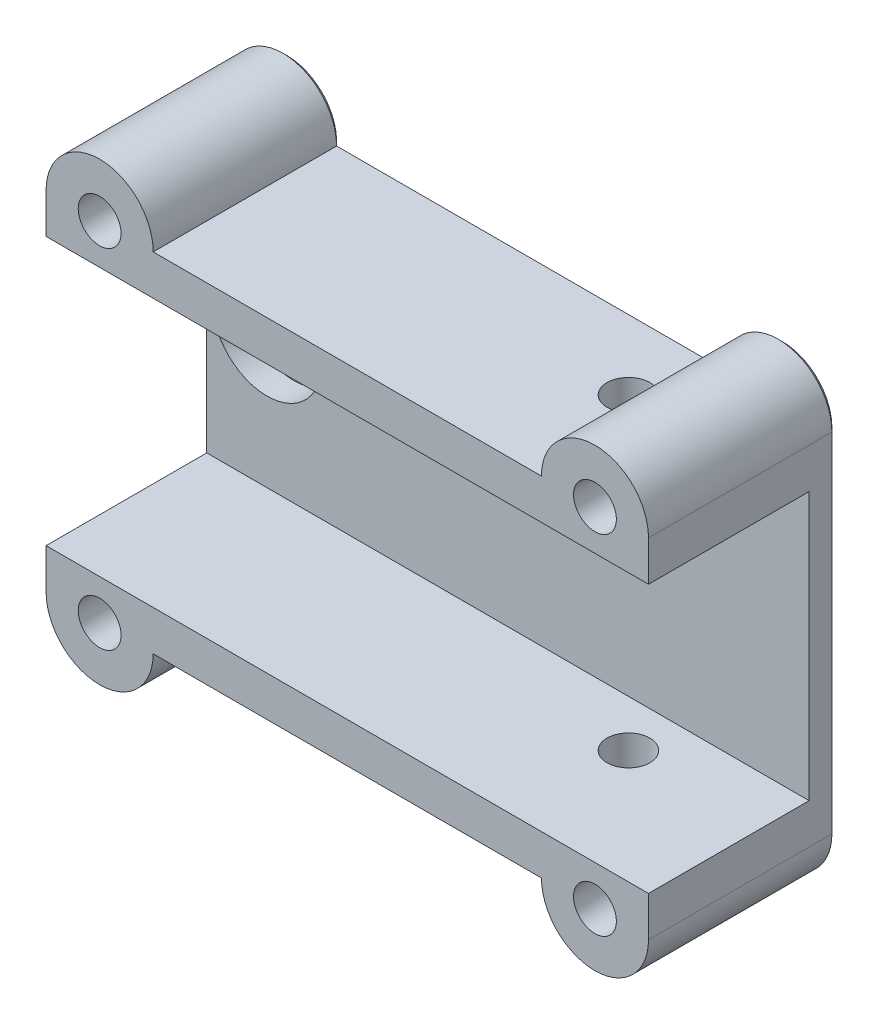
ISO-10303-21;
HEADER;
FILE_DESCRIPTION(('STEP AP214'),'2;1');
FILE_NAME('part.step','',(''),(''),'','','');
FILE_SCHEMA(('AUTOMOTIVE_DESIGN { 1 0 10303 214 1 1 1 1 }'));
ENDSEC;
DATA;
#1=APPLICATION_CONTEXT('core data for automotive mechanical design processes');
#2=APPLICATION_PROTOCOL_DEFINITION('international standard','automotive_design',2000,#1);
#3=PRODUCT_CONTEXT('',#1,'mechanical');
#4=PRODUCT('Part','Part','',(#3));
#5=PRODUCT_RELATED_PRODUCT_CATEGORY('part','',(#4));
#6=PRODUCT_DEFINITION_FORMATION('','',#4);
#7=PRODUCT_DEFINITION_CONTEXT('part definition',#1,'design');
#8=PRODUCT_DEFINITION('design','',#6,#7);
#9=PRODUCT_DEFINITION_SHAPE('','',#8);
#10=(LENGTH_UNIT() NAMED_UNIT(*) SI_UNIT(.MILLI.,.METRE.));
#11=(NAMED_UNIT(*) PLANE_ANGLE_UNIT() SI_UNIT($,.RADIAN.));
#12=(NAMED_UNIT(*) SI_UNIT($,.STERADIAN.) SOLID_ANGLE_UNIT());
#13=UNCERTAINTY_MEASURE_WITH_UNIT(LENGTH_MEASURE(1.E-05),#10,'distance_accuracy_value','');
#14=(GEOMETRIC_REPRESENTATION_CONTEXT(3) GLOBAL_UNCERTAINTY_ASSIGNED_CONTEXT((#13)) GLOBAL_UNIT_ASSIGNED_CONTEXT((#10,
#11,#12)) REPRESENTATION_CONTEXT('',''));
#15=CARTESIAN_POINT('',(0.,0.,0.));
#16=DIRECTION('',(0.,0.,1.));
#17=DIRECTION('',(1.,0.,0.));
#18=AXIS2_PLACEMENT_3D('',#15,#16,#17);
#19=CARTESIAN_POINT('',(56.1,536.,36.));
#20=DIRECTION('',(0.,0.,-1.));
#21=DIRECTION('',(-1.,0.,0.));
#22=AXIS2_PLACEMENT_3D('',#19,#20,#21);
#23=CYLINDRICAL_SURFACE('',#22,1.6);
#24=CARTESIAN_POINT('',(56.1,536.,14.));
#25=DIRECTION('',(0.,0.,-1.));
#26=DIRECTION('',(-1.,0.,0.));
#27=AXIS2_PLACEMENT_3D('',#24,#25,#26);
#28=CIRCLE('',#27,1.6);
#29=CARTESIAN_POINT('',(54.5,536.,14.));
#30=VERTEX_POINT('',#29);
#31=EDGE_CURVE('E230',#30,#30,#28,.T.);
#32=ORIENTED_EDGE('',*,*,#31,.F.);
#33=EDGE_LOOP('',(#32));
#34=FACE_BOUND('',#33,.T.);
#35=CARTESIAN_POINT('',(56.1,536.,3.3));
#36=DIRECTION('',(0.,0.,-1.));
#37=DIRECTION('',(-1.,0.,0.));
#38=AXIS2_PLACEMENT_3D('',#35,#36,#37);
#39=CIRCLE('',#38,1.6);
#40=CARTESIAN_POINT('',(54.5,536.,3.3));
#41=VERTEX_POINT('',#40);
#42=EDGE_CURVE('E53',#41,#41,#39,.F.);
#43=ORIENTED_EDGE('',*,*,#42,.F.);
#44=EDGE_LOOP('',(#43));
#45=FACE_BOUND('',#44,.T.);
#46=ADVANCED_FACE('F47',(#34,#45),#23,.F.);
#47=CARTESIAN_POINT('',(56.1,562.,36.));
#48=DIRECTION('',(0.,0.,-1.));
#49=DIRECTION('',(-1.,0.,0.));
#50=AXIS2_PLACEMENT_3D('',#47,#48,#49);
#51=CYLINDRICAL_SURFACE('',#50,1.6);
#52=CARTESIAN_POINT('',(56.1,562.,14.));
#53=DIRECTION('',(0.,0.,-1.));
#54=DIRECTION('',(-1.,0.,0.));
#55=AXIS2_PLACEMENT_3D('',#52,#53,#54);
#56=CIRCLE('',#55,1.6);
#57=CARTESIAN_POINT('',(54.5,562.,14.));
#58=VERTEX_POINT('',#57);
#59=EDGE_CURVE('E322',#58,#58,#56,.T.);
#60=ORIENTED_EDGE('',*,*,#59,.F.);
#61=EDGE_LOOP('',(#60));
#62=FACE_BOUND('',#61,.T.);
#63=CARTESIAN_POINT('',(56.1,562.,3.3));
#64=DIRECTION('',(0.,0.,-1.));
#65=DIRECTION('',(-1.,0.,0.));
#66=AXIS2_PLACEMENT_3D('',#63,#64,#65);
#67=CIRCLE('',#66,1.6);
#68=CARTESIAN_POINT('',(54.5,562.,3.3));
#69=VERTEX_POINT('',#68);
#70=EDGE_CURVE('E427',#69,#69,#67,.F.);
#71=ORIENTED_EDGE('',*,*,#70,.F.);
#72=EDGE_LOOP('',(#71));
#73=FACE_BOUND('',#72,.T.);
#74=ADVANCED_FACE('F437',(#62,#73),#51,.F.);
#75=CARTESIAN_POINT('',(93.1,562.,36.));
#76=DIRECTION('',(0.,0.,-1.));
#77=DIRECTION('',(-1.,0.,0.));
#78=AXIS2_PLACEMENT_3D('',#75,#76,#77);
#79=CYLINDRICAL_SURFACE('',#78,1.6);
#80=CARTESIAN_POINT('',(93.1,562.,14.));
#81=DIRECTION('',(0.,0.,-1.));
#82=DIRECTION('',(-1.,0.,0.));
#83=AXIS2_PLACEMENT_3D('',#80,#81,#82);
#84=CIRCLE('',#83,1.6);
#85=CARTESIAN_POINT('',(91.5,562.,14.));
#86=VERTEX_POINT('',#85);
#87=EDGE_CURVE('E325',#86,#86,#84,.T.);
#88=ORIENTED_EDGE('',*,*,#87,.F.);
#89=EDGE_LOOP('',(#88));
#90=FACE_BOUND('',#89,.T.);
#91=CARTESIAN_POINT('',(93.1,562.,3.3));
#92=DIRECTION('',(0.,0.,-1.));
#93=DIRECTION('',(-1.,0.,0.));
#94=AXIS2_PLACEMENT_3D('',#91,#92,#93);
#95=CIRCLE('',#94,1.6);
#96=CARTESIAN_POINT('',(91.5,562.,3.3));
#97=VERTEX_POINT('',#96);
#98=EDGE_CURVE('E424',#97,#97,#95,.F.);
#99=ORIENTED_EDGE('',*,*,#98,.F.);
#100=EDGE_LOOP('',(#99));
#101=FACE_BOUND('',#100,.T.);
#102=ADVANCED_FACE('F443',(#90,#101),#79,.F.);
#103=CARTESIAN_POINT('',(93.1,536.,36.));
#104=DIRECTION('',(0.,0.,-1.));
#105=DIRECTION('',(-1.,0.,0.));
#106=AXIS2_PLACEMENT_3D('',#103,#104,#105);
#107=CYLINDRICAL_SURFACE('',#106,1.6);
#108=CARTESIAN_POINT('',(93.1,536.,14.));
#109=DIRECTION('',(0.,0.,-1.));
#110=DIRECTION('',(-1.,0.,0.));
#111=AXIS2_PLACEMENT_3D('',#108,#109,#110);
#112=CIRCLE('',#111,1.6);
#113=CARTESIAN_POINT('',(91.5,536.,14.));
#114=VERTEX_POINT('',#113);
#115=EDGE_CURVE('E206',#114,#114,#112,.T.);
#116=ORIENTED_EDGE('',*,*,#115,.F.);
#117=EDGE_LOOP('',(#116));
#118=FACE_BOUND('',#117,.T.);
#119=CARTESIAN_POINT('',(93.1,536.,3.3));
#120=DIRECTION('',(0.,0.,-1.));
#121=DIRECTION('',(-1.,0.,0.));
#122=AXIS2_PLACEMENT_3D('',#119,#120,#121);
#123=CIRCLE('',#122,1.6);
#124=CARTESIAN_POINT('',(91.5,536.,3.3));
#125=VERTEX_POINT('',#124);
#126=EDGE_CURVE('E421',#125,#125,#123,.F.);
#127=ORIENTED_EDGE('',*,*,#126,.F.);
#128=EDGE_LOOP('',(#127));
#129=FACE_BOUND('',#128,.T.);
#130=ADVANCED_FACE('F449',(#118,#129),#107,.F.);
#131=CARTESIAN_POINT('',(-14.,337.,14.));
#132=DIRECTION('',(0.,0.,-1.));
#133=DIRECTION('',(-1.,0.,0.));
#134=AXIS2_PLACEMENT_3D('',#131,#132,#133);
#135=PLANE('',#134);
#136=ORIENTED_EDGE('',*,*,#115,.T.);
#137=EDGE_LOOP('',(#136));
#138=FACE_BOUND('',#137,.T.);
#139=ORIENTED_EDGE('',*,*,#31,.T.);
#140=EDGE_LOOP('',(#139));
#141=FACE_BOUND('',#140,.T.);
#142=DIRECTION('',(1.,0.,0.));
#143=VECTOR('',#142,1.);
#144=CARTESIAN_POINT('',(74.6,539.,14.));
#145=LINE('',#144,#143);
#146=CARTESIAN_POINT('',(52.1,539.,14.));
#147=VERTEX_POINT('',#146);
#148=CARTESIAN_POINT('',(97.1,539.,14.));
#149=VERTEX_POINT('',#148);
#150=EDGE_CURVE('E184',#147,#149,#145,.T.);
#151=ORIENTED_EDGE('',*,*,#150,.F.);
#152=DIRECTION('',(0.,1.,0.));
#153=VECTOR('',#152,1.);
#154=CARTESIAN_POINT('',(52.1,549.,14.));
#155=LINE('',#154,#153);
#156=CARTESIAN_POINT('',(52.1,536.,14.));
#157=VERTEX_POINT('',#156);
#158=EDGE_CURVE('E242',#157,#147,#155,.T.);
#159=ORIENTED_EDGE('',*,*,#158,.F.);
#160=CARTESIAN_POINT('',(56.1,536.,14.));
#161=DIRECTION('',(0.,0.,-1.));
#162=DIRECTION('',(-1.,0.,0.));
#163=AXIS2_PLACEMENT_3D('',#160,#161,#162);
#164=CIRCLE('',#163,4.);
#165=CARTESIAN_POINT('',(60.1,536.,14.));
#166=VERTEX_POINT('',#165);
#167=EDGE_CURVE('E272',#166,#157,#164,.T.);
#168=ORIENTED_EDGE('',*,*,#167,.F.);
#169=DIRECTION('',(-1.,0.,0.));
#170=VECTOR('',#169,1.);
#171=CARTESIAN_POINT('',(74.6,536.,14.));
#172=LINE('',#171,#170);
#173=CARTESIAN_POINT('',(89.1,536.,14.));
#174=VERTEX_POINT('',#173);
#175=EDGE_CURVE('E256',#174,#166,#172,.T.);
#176=ORIENTED_EDGE('',*,*,#175,.F.);
#177=CARTESIAN_POINT('',(93.1,536.,14.));
#178=DIRECTION('',(0.,0.,-1.));
#179=DIRECTION('',(-1.,0.,0.));
#180=AXIS2_PLACEMENT_3D('',#177,#178,#179);
#181=CIRCLE('',#180,4.);
#182=CARTESIAN_POINT('',(97.1,536.,14.));
#183=VERTEX_POINT('',#182);
#184=EDGE_CURVE('E264',#183,#174,#181,.T.);
#185=ORIENTED_EDGE('',*,*,#184,.F.);
#186=DIRECTION('',(0.,-1.,0.));
#187=VECTOR('',#186,1.);
#188=CARTESIAN_POINT('',(97.1,549.,14.));
#189=LINE('',#188,#187);
#190=EDGE_CURVE('E251',#149,#183,#189,.T.);
#191=ORIENTED_EDGE('',*,*,#190,.F.);
#192=EDGE_LOOP('',(#151,#159,#168,#176,#185,#191));
#193=FACE_BOUND('',#192,.T.);
#194=ADVANCED_FACE('F468',(#138,#141,#193),#135,.F.);
#195=CARTESIAN_POINT('',(52.1,549.,14.));
#196=DIRECTION('',(-1.,0.,0.));
#197=DIRECTION('',(0.,0.,1.));
#198=AXIS2_PLACEMENT_3D('',#195,#196,#197);
#199=PLANE('',#198);
#200=DIRECTION('',(0.,0.,-1.));
#201=VECTOR('',#200,1.);
#202=CARTESIAN_POINT('',(52.1,562.,14.));
#203=LINE('',#202,#201);
#204=CARTESIAN_POINT('',(52.1,562.,14.));
#205=VERTEX_POINT('',#204);
#206=CARTESIAN_POINT('',(52.1,562.,0.3));
#207=VERTEX_POINT('',#206);
#208=EDGE_CURVE('E280',#205,#207,#203,.T.);
#209=ORIENTED_EDGE('',*,*,#208,.T.);
#210=DIRECTION('',(0.,-1.,0.));
#211=VECTOR('',#210,1.);
#212=CARTESIAN_POINT('',(52.1,549.,0.3));
#213=LINE('',#212,#211);
#214=CARTESIAN_POINT('',(52.1,536.,0.3));
#215=VERTEX_POINT('',#214);
#216=EDGE_CURVE('E523',#207,#215,#213,.T.);
#217=ORIENTED_EDGE('',*,*,#216,.T.);
#218=DIRECTION('',(0.,0.,-1.));
#219=VECTOR('',#218,1.);
#220=CARTESIAN_POINT('',(52.1,536.,14.));
#221=LINE('',#220,#219);
#222=EDGE_CURVE('E283',#157,#215,#221,.T.);
#223=ORIENTED_EDGE('',*,*,#222,.F.);
#224=ORIENTED_EDGE('',*,*,#158,.T.);
#225=DIRECTION('',(0.,0.,1.));
#226=VECTOR('',#225,1.);
#227=CARTESIAN_POINT('',(52.1,539.,2.));
#228=LINE('',#227,#226);
#229=CARTESIAN_POINT('',(52.1,539.,2.));
#230=VERTEX_POINT('',#229);
#231=EDGE_CURVE('E175',#230,#147,#228,.T.);
#232=ORIENTED_EDGE('',*,*,#231,.F.);
#233=DIRECTION('',(0.,1.,0.));
#234=VECTOR('',#233,1.);
#235=CARTESIAN_POINT('',(52.1,549.,2.));
#236=LINE('',#235,#234);
#237=CARTESIAN_POINT('',(52.1,559.,2.));
#238=VERTEX_POINT('',#237);
#239=EDGE_CURVE('E179',#230,#238,#236,.T.);
#240=ORIENTED_EDGE('',*,*,#239,.T.);
#241=DIRECTION('',(0.,0.,1.));
#242=VECTOR('',#241,1.);
#243=CARTESIAN_POINT('',(52.1,559.,2.));
#244=LINE('',#243,#242);
#245=CARTESIAN_POINT('',(52.1,559.,14.));
#246=VERTEX_POINT('',#245);
#247=EDGE_CURVE('E164',#238,#246,#244,.T.);
#248=ORIENTED_EDGE('',*,*,#247,.T.);
#249=EDGE_CURVE('E174',#246,#205,#155,.T.);
#250=ORIENTED_EDGE('',*,*,#249,.T.);
#251=EDGE_LOOP('',(#209,#217,#223,#224,#232,#240,#248,#250));
#252=FACE_BOUND('',#251,.T.);
#253=ADVANCED_FACE('F188',(#252),#199,.T.);
#254=CARTESIAN_POINT('',(97.1,549.,14.));
#255=DIRECTION('',(1.,0.,0.));
#256=DIRECTION('',(0.,0.,-1.));
#257=AXIS2_PLACEMENT_3D('',#254,#255,#256);
#258=PLANE('',#257);
#259=DIRECTION('',(0.,0.,-1.));
#260=VECTOR('',#259,1.);
#261=CARTESIAN_POINT('',(97.1,536.,14.));
#262=LINE('',#261,#260);
#263=CARTESIAN_POINT('',(97.1,536.,0.3));
#264=VERTEX_POINT('',#263);
#265=EDGE_CURVE('E285',#183,#264,#262,.T.);
#266=ORIENTED_EDGE('',*,*,#265,.T.);
#267=DIRECTION('',(0.,1.,0.));
#268=VECTOR('',#267,1.);
#269=CARTESIAN_POINT('',(97.1,549.,0.3));
#270=LINE('',#269,#268);
#271=CARTESIAN_POINT('',(97.1,562.,0.3));
#272=VERTEX_POINT('',#271);
#273=EDGE_CURVE('E349',#264,#272,#270,.T.);
#274=ORIENTED_EDGE('',*,*,#273,.T.);
#275=DIRECTION('',(0.,0.,-1.));
#276=VECTOR('',#275,1.);
#277=CARTESIAN_POINT('',(97.1,562.,14.));
#278=LINE('',#277,#276);
#279=CARTESIAN_POINT('',(97.1,562.,14.));
#280=VERTEX_POINT('',#279);
#281=EDGE_CURVE('E297',#280,#272,#278,.T.);
#282=ORIENTED_EDGE('',*,*,#281,.F.);
#283=CARTESIAN_POINT('',(97.1,559.,14.));
#284=VERTEX_POINT('',#283);
#285=EDGE_CURVE('E252',#280,#284,#189,.T.);
#286=ORIENTED_EDGE('',*,*,#285,.T.);
#287=DIRECTION('',(0.,0.,1.));
#288=VECTOR('',#287,1.);
#289=CARTESIAN_POINT('',(97.1,559.,2.));
#290=LINE('',#289,#288);
#291=CARTESIAN_POINT('',(97.1,559.,2.));
#292=VERTEX_POINT('',#291);
#293=EDGE_CURVE('E202',#292,#284,#290,.T.);
#294=ORIENTED_EDGE('',*,*,#293,.F.);
#295=DIRECTION('',(0.,-1.,0.));
#296=VECTOR('',#295,1.);
#297=CARTESIAN_POINT('',(97.1,549.,2.));
#298=LINE('',#297,#296);
#299=CARTESIAN_POINT('',(97.1,539.,2.));
#300=VERTEX_POINT('',#299);
#301=EDGE_CURVE('E182',#292,#300,#298,.T.);
#302=ORIENTED_EDGE('',*,*,#301,.T.);
#303=DIRECTION('',(0.,0.,1.));
#304=VECTOR('',#303,1.);
#305=CARTESIAN_POINT('',(97.1,539.,2.));
#306=LINE('',#305,#304);
#307=EDGE_CURVE('E599',#300,#149,#306,.T.);
#308=ORIENTED_EDGE('',*,*,#307,.T.);
#309=ORIENTED_EDGE('',*,*,#190,.T.);
#310=EDGE_LOOP('',(#266,#274,#282,#286,#294,#302,#308,#309));
#311=FACE_BOUND('',#310,.T.);
#312=ADVANCED_FACE('F476',(#311),#258,.T.);
#313=CARTESIAN_POINT('',(56.1,536.,14.));
#314=DIRECTION('',(0.,0.,-1.));
#315=DIRECTION('',(-1.,0.,0.));
#316=AXIS2_PLACEMENT_3D('',#313,#314,#315);
#317=CYLINDRICAL_SURFACE('',#316,4.);
#318=ORIENTED_EDGE('',*,*,#222,.T.);
#319=CARTESIAN_POINT('',(56.1,536.,0.3));
#320=DIRECTION('',(0.,0.,-1.));
#321=DIRECTION('',(-1.,0.,0.));
#322=AXIS2_PLACEMENT_3D('',#319,#320,#321);
#323=CIRCLE('',#322,4.);
#324=CARTESIAN_POINT('',(60.1,536.,0.3));
#325=VERTEX_POINT('',#324);
#326=EDGE_CURVE('E536',#215,#325,#323,.F.);
#327=ORIENTED_EDGE('',*,*,#326,.T.);
#328=DIRECTION('',(0.,0.,-1.));
#329=VECTOR('',#328,1.);
#330=CARTESIAN_POINT('',(60.1,536.,14.));
#331=LINE('',#330,#329);
#332=EDGE_CURVE('E275',#166,#325,#331,.T.);
#333=ORIENTED_EDGE('',*,*,#332,.F.);
#334=ORIENTED_EDGE('',*,*,#167,.T.);
#335=EDGE_LOOP('',(#318,#327,#333,#334));
#336=FACE_BOUND('',#335,.T.);
#337=ADVANCED_FACE('F472',(#336),#317,.T.);
#338=CARTESIAN_POINT('',(56.1,562.,14.));
#339=DIRECTION('',(0.,0.,-1.));
#340=DIRECTION('',(-1.,0.,0.));
#341=AXIS2_PLACEMENT_3D('',#338,#339,#340);
#342=CYLINDRICAL_SURFACE('',#341,4.);
#343=DIRECTION('',(0.,0.,-1.));
#344=VECTOR('',#343,1.);
#345=CARTESIAN_POINT('',(60.1,562.,14.));
#346=LINE('',#345,#344);
#347=CARTESIAN_POINT('',(60.1,562.,14.));
#348=VERTEX_POINT('',#347);
#349=CARTESIAN_POINT('',(60.1,562.,0.3));
#350=VERTEX_POINT('',#349);
#351=EDGE_CURVE('E284',#348,#350,#346,.T.);
#352=ORIENTED_EDGE('',*,*,#351,.T.);
#353=CARTESIAN_POINT('',(56.1,562.,0.3));
#354=DIRECTION('',(0.,0.,-1.));
#355=DIRECTION('',(-1.,0.,0.));
#356=AXIS2_PLACEMENT_3D('',#353,#354,#355);
#357=CIRCLE('',#356,4.);
#358=EDGE_CURVE('E320',#350,#207,#357,.F.);
#359=ORIENTED_EDGE('',*,*,#358,.T.);
#360=ORIENTED_EDGE('',*,*,#208,.F.);
#361=CARTESIAN_POINT('',(56.1,562.,14.));
#362=DIRECTION('',(0.,0.,-1.));
#363=DIRECTION('',(-1.,0.,0.));
#364=AXIS2_PLACEMENT_3D('',#361,#362,#363);
#365=CIRCLE('',#364,4.);
#366=EDGE_CURVE('E268',#205,#348,#365,.T.);
#367=ORIENTED_EDGE('',*,*,#366,.T.);
#368=EDGE_LOOP('',(#352,#359,#360,#367));
#369=FACE_BOUND('',#368,.T.);
#370=ADVANCED_FACE('F475',(#369),#342,.T.);
#371=CARTESIAN_POINT('',(74.6,562.,14.));
#372=DIRECTION('',(0.,-1.,0.));
#373=DIRECTION('',(0.,0.,-1.));
#374=AXIS2_PLACEMENT_3D('',#371,#372,#373);
#375=PLANE('',#374);
#376=CARTESIAN_POINT('',(87.1,562.,5.5));
#377=DIRECTION('',(0.,1.,0.));
#378=DIRECTION('',(0.,0.,1.));
#379=AXIS2_PLACEMENT_3D('',#376,#377,#378);
#380=CIRCLE('',#379,1.6);
#381=CARTESIAN_POINT('',(87.1,562.,7.1));
#382=VERTEX_POINT('',#381);
#383=EDGE_CURVE('E225',#382,#382,#380,.T.);
#384=ORIENTED_EDGE('',*,*,#383,.F.);
#385=EDGE_LOOP('',(#384));
#386=FACE_BOUND('',#385,.T.);
#387=DIRECTION('',(0.,0.,-1.));
#388=VECTOR('',#387,1.);
#389=CARTESIAN_POINT('',(89.1,562.,14.));
#390=LINE('',#389,#388);
#391=CARTESIAN_POINT('',(89.1,562.,14.));
#392=VERTEX_POINT('',#391);
#393=CARTESIAN_POINT('',(89.1,562.,0.3));
#394=VERTEX_POINT('',#393);
#395=EDGE_CURVE('E293',#392,#394,#390,.T.);
#396=ORIENTED_EDGE('',*,*,#395,.T.);
#397=DIRECTION('',(-1.,0.,0.));
#398=VECTOR('',#397,1.);
#399=CARTESIAN_POINT('',(59.8,562.,0.3));
#400=LINE('',#399,#398);
#401=EDGE_CURVE('E355',#394,#350,#400,.T.);
#402=ORIENTED_EDGE('',*,*,#401,.T.);
#403=ORIENTED_EDGE('',*,*,#351,.F.);
#404=DIRECTION('',(-1.,0.,0.));
#405=VECTOR('',#404,1.);
#406=CARTESIAN_POINT('',(74.6,562.,14.));
#407=LINE('',#406,#405);
#408=EDGE_CURVE('E246',#392,#348,#407,.T.);
#409=ORIENTED_EDGE('',*,*,#408,.F.);
#410=EDGE_LOOP('',(#396,#402,#403,#409));
#411=FACE_BOUND('',#410,.T.);
#412=ADVANCED_FACE('F480',(#386,#411),#375,.F.);
#413=CARTESIAN_POINT('',(93.1,562.,14.));
#414=DIRECTION('',(0.,0.,-1.));
#415=DIRECTION('',(-1.,0.,0.));
#416=AXIS2_PLACEMENT_3D('',#413,#414,#415);
#417=CYLINDRICAL_SURFACE('',#416,4.);
#418=ORIENTED_EDGE('',*,*,#281,.T.);
#419=CARTESIAN_POINT('',(93.1,562.,0.3));
#420=DIRECTION('',(0.,0.,-1.));
#421=DIRECTION('',(-1.,0.,0.));
#422=AXIS2_PLACEMENT_3D('',#419,#420,#421);
#423=CIRCLE('',#422,4.);
#424=EDGE_CURVE('E542',#272,#394,#423,.F.);
#425=ORIENTED_EDGE('',*,*,#424,.T.);
#426=ORIENTED_EDGE('',*,*,#395,.F.);
#427=CARTESIAN_POINT('',(93.1,562.,14.));
#428=DIRECTION('',(0.,0.,-1.));
#429=DIRECTION('',(-1.,0.,0.));
#430=AXIS2_PLACEMENT_3D('',#427,#428,#429);
#431=CIRCLE('',#430,4.);
#432=EDGE_CURVE('E260',#392,#280,#431,.T.);
#433=ORIENTED_EDGE('',*,*,#432,.T.);
#434=EDGE_LOOP('',(#418,#425,#426,#433));
#435=FACE_BOUND('',#434,.T.);
#436=ADVANCED_FACE('F485',(#435),#417,.T.);
#437=CARTESIAN_POINT('',(93.1,536.,14.));
#438=DIRECTION('',(0.,0.,-1.));
#439=DIRECTION('',(-1.,0.,0.));
#440=AXIS2_PLACEMENT_3D('',#437,#438,#439);
#441=CYLINDRICAL_SURFACE('',#440,4.);
#442=DIRECTION('',(0.,0.,-1.));
#443=VECTOR('',#442,1.);
#444=CARTESIAN_POINT('',(89.1,536.,14.));
#445=LINE('',#444,#443);
#446=CARTESIAN_POINT('',(89.1,536.,0.3));
#447=VERTEX_POINT('',#446);
#448=EDGE_CURVE('E279',#174,#447,#445,.T.);
#449=ORIENTED_EDGE('',*,*,#448,.T.);
#450=CARTESIAN_POINT('',(93.1,536.,0.3));
#451=DIRECTION('',(0.,0.,-1.));
#452=DIRECTION('',(-1.,0.,0.));
#453=AXIS2_PLACEMENT_3D('',#450,#451,#452);
#454=CIRCLE('',#453,4.);
#455=EDGE_CURVE('E541',#447,#264,#454,.F.);
#456=ORIENTED_EDGE('',*,*,#455,.T.);
#457=ORIENTED_EDGE('',*,*,#265,.F.);
#458=ORIENTED_EDGE('',*,*,#184,.T.);
#459=EDGE_LOOP('',(#449,#456,#457,#458));
#460=FACE_BOUND('',#459,.T.);
#461=ADVANCED_FACE('F482',(#460),#441,.T.);
#462=CARTESIAN_POINT('',(74.6,536.,14.));
#463=DIRECTION('',(0.,-1.,0.));
#464=DIRECTION('',(0.,0.,-1.));
#465=AXIS2_PLACEMENT_3D('',#462,#463,#464);
#466=PLANE('',#465);
#467=CARTESIAN_POINT('',(87.1,536.,5.5));
#468=DIRECTION('',(0.,-1.,0.));
#469=DIRECTION('',(0.,0.,-1.));
#470=AXIS2_PLACEMENT_3D('',#467,#468,#469);
#471=CIRCLE('',#470,1.6);
#472=CARTESIAN_POINT('',(87.1,536.,3.9));
#473=VERTEX_POINT('',#472);
#474=EDGE_CURVE('E223',#473,#473,#471,.T.);
#475=ORIENTED_EDGE('',*,*,#474,.F.);
#476=EDGE_LOOP('',(#475));
#477=FACE_BOUND('',#476,.T.);
#478=ORIENTED_EDGE('',*,*,#332,.T.);
#479=DIRECTION('',(1.,0.,0.));
#480=VECTOR('',#479,1.);
#481=CARTESIAN_POINT('',(74.6,536.,0.3));
#482=LINE('',#481,#480);
#483=EDGE_CURVE('E556',#325,#447,#482,.T.);
#484=ORIENTED_EDGE('',*,*,#483,.T.);
#485=ORIENTED_EDGE('',*,*,#448,.F.);
#486=ORIENTED_EDGE('',*,*,#175,.T.);
#487=EDGE_LOOP('',(#478,#484,#485,#486));
#488=FACE_BOUND('',#487,.T.);
#489=ADVANCED_FACE('F466',(#477,#488),#466,.T.);
#490=ORIENTED_EDGE('',*,*,#87,.T.);
#491=EDGE_LOOP('',(#490));
#492=FACE_BOUND('',#491,.T.);
#493=ORIENTED_EDGE('',*,*,#59,.T.);
#494=EDGE_LOOP('',(#493));
#495=FACE_BOUND('',#494,.T.);
#496=ORIENTED_EDGE('',*,*,#249,.F.);
#497=DIRECTION('',(1.,0.,0.));
#498=VECTOR('',#497,1.);
#499=CARTESIAN_POINT('',(74.6,559.,14.));
#500=LINE('',#499,#498);
#501=EDGE_CURVE('E170',#246,#284,#500,.T.);
#502=ORIENTED_EDGE('',*,*,#501,.T.);
#503=ORIENTED_EDGE('',*,*,#285,.F.);
#504=ORIENTED_EDGE('',*,*,#432,.F.);
#505=ORIENTED_EDGE('',*,*,#408,.T.);
#506=ORIENTED_EDGE('',*,*,#366,.F.);
#507=EDGE_LOOP('',(#496,#502,#503,#504,#505,#506));
#508=FACE_BOUND('',#507,.T.);
#509=ADVANCED_FACE('F463',(#492,#495,#508),#135,.F.);
#510=CARTESIAN_POINT('',(-14.,337.,0.));
#511=DIRECTION('',(0.,0.,-1.));
#512=DIRECTION('',(-1.,0.,0.));
#513=AXIS2_PLACEMENT_3D('',#510,#511,#512);
#514=PLANE('',#513);
#515=CARTESIAN_POINT('',(93.1,536.,0.));
#516=DIRECTION('',(0.,0.,-1.));
#517=DIRECTION('',(-1.,0.,0.));
#518=AXIS2_PLACEMENT_3D('',#515,#516,#517);
#519=CIRCLE('',#518,2.95000000000001);
#520=CARTESIAN_POINT('',(90.15,536.,0.));
#521=VERTEX_POINT('',#520);
#522=EDGE_CURVE('E632',#521,#521,#519,.T.);
#523=ORIENTED_EDGE('',*,*,#522,.F.);
#524=EDGE_LOOP('',(#523));
#525=FACE_BOUND('',#524,.T.);
#526=CARTESIAN_POINT('',(56.1,562.,0.));
#527=DIRECTION('',(0.,0.,-1.));
#528=DIRECTION('',(-1.,0.,0.));
#529=AXIS2_PLACEMENT_3D('',#526,#527,#528);
#530=CIRCLE('',#529,2.95000000000001);
#531=CARTESIAN_POINT('',(53.15,562.,0.));
#532=VERTEX_POINT('',#531);
#533=EDGE_CURVE('E625',#532,#532,#530,.T.);
#534=ORIENTED_EDGE('',*,*,#533,.F.);
#535=EDGE_LOOP('',(#534));
#536=FACE_BOUND('',#535,.T.);
#537=CARTESIAN_POINT('',(56.1,536.,0.));
#538=DIRECTION('',(0.,0.,-1.));
#539=DIRECTION('',(-1.,0.,0.));
#540=AXIS2_PLACEMENT_3D('',#537,#538,#539);
#541=CIRCLE('',#540,2.95000000000001);
#542=CARTESIAN_POINT('',(53.15,536.,0.));
#543=VERTEX_POINT('',#542);
#544=EDGE_CURVE('E637',#543,#543,#541,.T.);
#545=ORIENTED_EDGE('',*,*,#544,.F.);
#546=EDGE_LOOP('',(#545));
#547=FACE_BOUND('',#546,.T.);
#548=CARTESIAN_POINT('',(93.1,562.,0.));
#549=DIRECTION('',(0.,0.,-1.));
#550=DIRECTION('',(-1.,0.,0.));
#551=AXIS2_PLACEMENT_3D('',#548,#549,#550);
#552=CIRCLE('',#551,2.95000000000001);
#553=CARTESIAN_POINT('',(90.15,562.,0.));
#554=VERTEX_POINT('',#553);
#555=EDGE_CURVE('E619',#554,#554,#552,.T.);
#556=ORIENTED_EDGE('',*,*,#555,.F.);
#557=EDGE_LOOP('',(#556));
#558=FACE_BOUND('',#557,.T.);
#559=CARTESIAN_POINT('',(56.6,549.,0.));
#560=DIRECTION('',(0.,0.,-1.));
#561=DIRECTION('',(-1.,0.,0.));
#562=AXIS2_PLACEMENT_3D('',#559,#560,#561);
#563=CIRCLE('',#562,4.075);
#564=CARTESIAN_POINT('',(52.525,549.,0.));
#565=VERTEX_POINT('',#564);
#566=EDGE_CURVE('E529',#565,#565,#563,.T.);
#567=ORIENTED_EDGE('',*,*,#566,.F.);
#568=EDGE_LOOP('',(#567));
#569=FACE_BOUND('',#568,.T.);
#570=CARTESIAN_POINT('',(56.1,562.,0.));
#571=DIRECTION('',(0.,0.,-1.));
#572=DIRECTION('',(-1.,0.,0.));
#573=AXIS2_PLACEMENT_3D('',#570,#571,#572);
#574=CIRCLE('',#573,3.7);
#575=CARTESIAN_POINT('',(52.4,562.,0.));
#576=VERTEX_POINT('',#575);
#577=CARTESIAN_POINT('',(59.7878177829171,561.7,0.));
#578=VERTEX_POINT('',#577);
#579=EDGE_CURVE('E66',#576,#578,#574,.T.);
#580=ORIENTED_EDGE('',*,*,#579,.T.);
#581=DIRECTION('',(1.,0.,0.));
#582=VECTOR('',#581,1.);
#583=CARTESIAN_POINT('',(89.4,561.7,0.));
#584=LINE('',#583,#582);
#585=CARTESIAN_POINT('',(89.4121822170828,561.7,0.));
#586=VERTEX_POINT('',#585);
#587=EDGE_CURVE('E554',#578,#586,#584,.T.);
#588=ORIENTED_EDGE('',*,*,#587,.T.);
#589=CARTESIAN_POINT('',(93.1,562.,0.));
#590=DIRECTION('',(0.,0.,-1.));
#591=DIRECTION('',(-1.,0.,0.));
#592=AXIS2_PLACEMENT_3D('',#589,#590,#591);
#593=CIRCLE('',#592,3.7);
#594=CARTESIAN_POINT('',(96.8,562.,0.));
#595=VERTEX_POINT('',#594);
#596=EDGE_CURVE('E74',#586,#595,#593,.T.);
#597=ORIENTED_EDGE('',*,*,#596,.T.);
#598=DIRECTION('',(0.,-1.,0.));
#599=VECTOR('',#598,1.);
#600=CARTESIAN_POINT('',(96.8,337.,0.));
#601=LINE('',#600,#599);
#602=CARTESIAN_POINT('',(96.8,536.,0.));
#603=VERTEX_POINT('',#602);
#604=EDGE_CURVE('E535',#595,#603,#601,.T.);
#605=ORIENTED_EDGE('',*,*,#604,.T.);
#606=CARTESIAN_POINT('',(93.1,536.,0.));
#607=DIRECTION('',(0.,0.,-1.));
#608=DIRECTION('',(-1.,0.,0.));
#609=AXIS2_PLACEMENT_3D('',#606,#607,#608);
#610=CIRCLE('',#609,3.7);
#611=CARTESIAN_POINT('',(89.4121822170828,536.3,0.));
#612=VERTEX_POINT('',#611);
#613=EDGE_CURVE('E539',#603,#612,#610,.T.);
#614=ORIENTED_EDGE('',*,*,#613,.T.);
#615=DIRECTION('',(-1.,0.,0.));
#616=VECTOR('',#615,1.);
#617=CARTESIAN_POINT('',(-14.,536.3,0.));
#618=LINE('',#617,#616);
#619=CARTESIAN_POINT('',(59.7878177829171,536.3,0.));
#620=VERTEX_POINT('',#619);
#621=EDGE_CURVE('E549',#612,#620,#618,.T.);
#622=ORIENTED_EDGE('',*,*,#621,.T.);
#623=CARTESIAN_POINT('',(56.1,536.,0.));
#624=DIRECTION('',(0.,0.,-1.));
#625=DIRECTION('',(-1.,0.,0.));
#626=AXIS2_PLACEMENT_3D('',#623,#624,#625);
#627=CIRCLE('',#626,3.7);
#628=CARTESIAN_POINT('',(52.4,536.,0.));
#629=VERTEX_POINT('',#628);
#630=EDGE_CURVE('E311',#620,#629,#627,.T.);
#631=ORIENTED_EDGE('',*,*,#630,.T.);
#632=DIRECTION('',(0.,1.,0.));
#633=VECTOR('',#632,1.);
#634=CARTESIAN_POINT('',(52.4,337.,0.));
#635=LINE('',#634,#633);
#636=EDGE_CURVE('E314',#629,#576,#635,.T.);
#637=ORIENTED_EDGE('',*,*,#636,.T.);
#638=EDGE_LOOP('',(#580,#588,#597,#605,#614,#622,#631,#637));
#639=FACE_BOUND('',#638,.T.);
#640=ADVANCED_FACE('F461',(#525,#536,#547,#558,#569,#639),#514,.T.);
#641=CARTESIAN_POINT('',(74.6,559.,2.));
#642=DIRECTION('',(0.,-1.,0.));
#643=DIRECTION('',(0.,0.,-1.));
#644=AXIS2_PLACEMENT_3D('',#641,#642,#643);
#645=PLANE('',#644);
#646=CARTESIAN_POINT('',(87.1,559.,5.5));
#647=DIRECTION('',(0.,-1.,0.));
#648=DIRECTION('',(0.,0.,-1.));
#649=AXIS2_PLACEMENT_3D('',#646,#647,#648);
#650=CIRCLE('',#649,1.6);
#651=CARTESIAN_POINT('',(87.1,559.,3.9));
#652=VERTEX_POINT('',#651);
#653=EDGE_CURVE('E218',#652,#652,#650,.T.);
#654=ORIENTED_EDGE('',*,*,#653,.F.);
#655=EDGE_LOOP('',(#654));
#656=FACE_BOUND('',#655,.T.);
#657=ORIENTED_EDGE('',*,*,#501,.F.);
#658=ORIENTED_EDGE('',*,*,#247,.F.);
#659=DIRECTION('',(1.,0.,0.));
#660=VECTOR('',#659,1.);
#661=CARTESIAN_POINT('',(74.6,559.,2.));
#662=LINE('',#661,#660);
#663=EDGE_CURVE('E167',#238,#292,#662,.T.);
#664=ORIENTED_EDGE('',*,*,#663,.T.);
#665=ORIENTED_EDGE('',*,*,#293,.T.);
#666=EDGE_LOOP('',(#657,#658,#664,#665));
#667=FACE_BOUND('',#666,.T.);
#668=ADVANCED_FACE('F166',(#656,#667),#645,.T.);
#669=CARTESIAN_POINT('',(74.6,539.,2.));
#670=DIRECTION('',(0.,-1.,0.));
#671=DIRECTION('',(0.,0.,-1.));
#672=AXIS2_PLACEMENT_3D('',#669,#670,#671);
#673=PLANE('',#672);
#674=CARTESIAN_POINT('',(87.1,539.,5.5));
#675=DIRECTION('',(0.,-1.,0.));
#676=DIRECTION('',(0.,0.,-1.));
#677=AXIS2_PLACEMENT_3D('',#674,#675,#676);
#678=CIRCLE('',#677,1.6);
#679=CARTESIAN_POINT('',(87.1,539.,3.9));
#680=VERTEX_POINT('',#679);
#681=EDGE_CURVE('E224',#680,#680,#678,.T.);
#682=ORIENTED_EDGE('',*,*,#681,.T.);
#683=EDGE_LOOP('',(#682));
#684=FACE_BOUND('',#683,.T.);
#685=ORIENTED_EDGE('',*,*,#150,.T.);
#686=ORIENTED_EDGE('',*,*,#307,.F.);
#687=DIRECTION('',(1.,0.,0.));
#688=VECTOR('',#687,1.);
#689=CARTESIAN_POINT('',(74.6,539.,2.));
#690=LINE('',#689,#688);
#691=EDGE_CURVE('E191',#230,#300,#690,.T.);
#692=ORIENTED_EDGE('',*,*,#691,.F.);
#693=ORIENTED_EDGE('',*,*,#231,.T.);
#694=EDGE_LOOP('',(#685,#686,#692,#693));
#695=FACE_BOUND('',#694,.T.);
#696=ADVANCED_FACE('F454',(#684,#695),#673,.F.);
#697=CARTESIAN_POINT('',(-14.,337.,2.));
#698=DIRECTION('',(0.,0.,1.));
#699=DIRECTION('',(0.,1.,0.));
#700=AXIS2_PLACEMENT_3D('',#697,#698,#699);
#701=PLANE('',#700);
#702=CARTESIAN_POINT('',(56.6,549.,2.));
#703=DIRECTION('',(0.,0.,1.));
#704=DIRECTION('',(1.,0.,0.));
#705=AXIS2_PLACEMENT_3D('',#702,#703,#704);
#706=CIRCLE('',#705,4.075);
#707=CARTESIAN_POINT('',(60.675,549.,2.));
#708=VERTEX_POINT('',#707);
#709=EDGE_CURVE('E526',#708,#708,#706,.T.);
#710=ORIENTED_EDGE('',*,*,#709,.F.);
#711=EDGE_LOOP('',(#710));
#712=FACE_BOUND('',#711,.T.);
#713=ORIENTED_EDGE('',*,*,#663,.F.);
#714=ORIENTED_EDGE('',*,*,#239,.F.);
#715=ORIENTED_EDGE('',*,*,#691,.T.);
#716=ORIENTED_EDGE('',*,*,#301,.F.);
#717=EDGE_LOOP('',(#713,#714,#715,#716));
#718=FACE_BOUND('',#717,.T.);
#719=ADVANCED_FACE('F178',(#712,#718),#701,.T.);
#720=CARTESIAN_POINT('',(87.1,522.,5.5));
#721=DIRECTION('',(0.,1.,0.));
#722=DIRECTION('',(0.,0.,1.));
#723=AXIS2_PLACEMENT_3D('',#720,#721,#722);
#724=CYLINDRICAL_SURFACE('',#723,1.6);
#725=ORIENTED_EDGE('',*,*,#474,.T.);
#726=EDGE_LOOP('',(#725));
#727=FACE_BOUND('',#726,.T.);
#728=ORIENTED_EDGE('',*,*,#681,.F.);
#729=EDGE_LOOP('',(#728));
#730=FACE_BOUND('',#729,.T.);
#731=ADVANCED_FACE('F453',(#727,#730),#724,.F.);
#732=ORIENTED_EDGE('',*,*,#653,.T.);
#733=EDGE_LOOP('',(#732));
#734=FACE_BOUND('',#733,.T.);
#735=ORIENTED_EDGE('',*,*,#383,.T.);
#736=EDGE_LOOP('',(#735));
#737=FACE_BOUND('',#736,.T.);
#738=ADVANCED_FACE('F675',(#734,#737),#724,.F.);
#739=CARTESIAN_POINT('',(56.6,549.,-1.3));
#740=DIRECTION('',(0.,0.,1.));
#741=DIRECTION('',(1.,0.,0.));
#742=AXIS2_PLACEMENT_3D('',#739,#740,#741);
#743=CYLINDRICAL_SURFACE('',#742,4.075);
#744=ORIENTED_EDGE('',*,*,#566,.T.);
#745=EDGE_LOOP('',(#744));
#746=FACE_BOUND('',#745,.T.);
#747=ORIENTED_EDGE('',*,*,#709,.T.);
#748=EDGE_LOOP('',(#747));
#749=FACE_BOUND('',#748,.T.);
#750=ADVANCED_FACE('F515',(#746,#749),#743,.F.);
#751=CARTESIAN_POINT('',(56.1,536.,0.));
#752=DIRECTION('',(0.,0.,1.));
#753=DIRECTION('',(1.,0.,0.));
#754=AXIS2_PLACEMENT_3D('',#751,#752,#753);
#755=CONICAL_SURFACE('',#754,3.7,0.785398163397439);
#756=ORIENTED_EDGE('',*,*,#630,.F.);
#757=CARTESIAN_POINT('',(59.7878177829171,536.3,0.));
#758=CARTESIAN_POINT('',(59.8145345460807,536.275368161135,0.0246318388646912));
#759=CARTESIAN_POINT('',(59.8410686680676,536.250637439957,0.049362560042557));
#760=CARTESIAN_POINT('',(59.8937806028026,536.200990464141,0.0990095358594307));
#761=CARTESIAN_POINT('',(59.9199584487804,536.176074227145,0.123925772855371));
#762=CARTESIAN_POINT('',(59.9719715800212,536.126064049857,0.173935950143329));
#763=CARTESIAN_POINT('',(59.9978068684255,536.100970111198,0.199029888802517));
#764=CARTESIAN_POINT('',(60.0491482759607,536.050610823948,0.249389176052502));
#765=CARTESIAN_POINT('',(60.0746543639477,536.025345459479,0.274654540521019));
#766=CARTESIAN_POINT('',(60.1,536.,0.299999999999966));
#767=B_SPLINE_CURVE_WITH_KNOTS('',3,(#757,#758,#759,#760,#761,#762,#763,#764,#765,#766),
.UNSPECIFIED.,.F.,.F.,(4,2,2,2,4),(0.,0.131700164692618,0.26338796037153,0.395074547589796,
0.526773503011606),.UNSPECIFIED.);
#768=EDGE_CURVE('E58',#620,#325,#767,.T.);
#769=ORIENTED_EDGE('',*,*,#768,.T.);
#770=ORIENTED_EDGE('',*,*,#326,.F.);
#771=DIRECTION('',(-0.707106781186542,0.,0.707106781186554));
#772=VECTOR('',#771,1.);
#773=CARTESIAN_POINT('',(52.4,536.,0.));
#774=LINE('',#773,#772);
#775=EDGE_CURVE('E521',#629,#215,#774,.T.);
#776=ORIENTED_EDGE('',*,*,#775,.F.);
#777=EDGE_LOOP('',(#756,#769,#770,#776));
#778=FACE_BOUND('',#777,.T.);
#779=ADVANCED_FACE('F412',(#778),#755,.T.);
#780=CARTESIAN_POINT('',(52.4,337.,0.));
#781=DIRECTION('',(0.707106781186554,0.,0.707106781186541));
#782=DIRECTION('',(0.,1.,0.));
#783=AXIS2_PLACEMENT_3D('',#780,#781,#782);
#784=PLANE('',#783);
#785=ORIENTED_EDGE('',*,*,#775,.T.);
#786=ORIENTED_EDGE('',*,*,#216,.F.);
#787=DIRECTION('',(-0.707106781186541,0.,0.707106781186554));
#788=VECTOR('',#787,1.);
#789=CARTESIAN_POINT('',(52.4,562.,0.));
#790=LINE('',#789,#788);
#791=EDGE_CURVE('E354',#576,#207,#790,.T.);
#792=ORIENTED_EDGE('',*,*,#791,.F.);
#793=ORIENTED_EDGE('',*,*,#636,.F.);
#794=EDGE_LOOP('',(#785,#786,#792,#793));
#795=FACE_BOUND('',#794,.T.);
#796=ADVANCED_FACE('F506',(#795),#784,.F.);
#797=CARTESIAN_POINT('',(56.1,562.,0.));
#798=DIRECTION('',(0.,0.,1.));
#799=DIRECTION('',(1.,0.,0.));
#800=AXIS2_PLACEMENT_3D('',#797,#798,#799);
#801=CONICAL_SURFACE('',#800,3.7,0.785398163397439);
#802=ORIENTED_EDGE('',*,*,#791,.T.);
#803=ORIENTED_EDGE('',*,*,#358,.F.);
#804=CARTESIAN_POINT('',(60.1,562.,0.3));
#805=CARTESIAN_POINT('',(60.0746543639477,561.974654540521,0.274654540521006));
#806=CARTESIAN_POINT('',(60.0491482759607,561.949389176052,0.249389176052464));
#807=CARTESIAN_POINT('',(59.9978068684254,561.899029888802,0.199029888802478));
#808=CARTESIAN_POINT('',(59.9719715800212,561.873935950143,0.173935950143313));
#809=CARTESIAN_POINT('',(59.9199584487804,561.823925772855,0.123925772855375));
#810=CARTESIAN_POINT('',(59.8937806028026,561.799009535859,0.0990095358594321));
#811=CARTESIAN_POINT('',(59.8410686680676,561.749362560043,0.0493625600425427));
#812=CARTESIAN_POINT('',(59.8145345460807,561.724631838865,0.0246318388646647));
#813=CARTESIAN_POINT('',(59.7878177829171,561.7,0.));
#814=B_SPLINE_CURVE_WITH_KNOTS('',3,(#804,#805,#806,#807,#808,#809,#810,#811,#812,#813),
.UNSPECIFIED.,.F.,.F.,(4,2,2,2,4),(0.,0.131698955421964,0.263385542640168,0.395073338319,
0.526773503011692),.UNSPECIFIED.);
#815=EDGE_CURVE('E374',#350,#578,#814,.T.);
#816=ORIENTED_EDGE('',*,*,#815,.T.);
#817=ORIENTED_EDGE('',*,*,#579,.F.);
#818=EDGE_LOOP('',(#802,#803,#816,#817));
#819=FACE_BOUND('',#818,.T.);
#820=ADVANCED_FACE('F398',(#819),#801,.T.);
#821=CARTESIAN_POINT('',(93.1,562.,0.));
#822=DIRECTION('',(0.,0.,1.));
#823=DIRECTION('',(1.,0.,0.));
#824=AXIS2_PLACEMENT_3D('',#821,#822,#823);
#825=CONICAL_SURFACE('',#824,3.7,0.785398163397439);
#826=ORIENTED_EDGE('',*,*,#596,.F.);
#827=CARTESIAN_POINT('',(89.4121822170828,561.7,0.));
#828=CARTESIAN_POINT('',(89.3854654539193,561.724631838865,0.0246318388646844));
#829=CARTESIAN_POINT('',(89.3589313319323,561.749362560043,0.0493625600425654));
#830=CARTESIAN_POINT('',(89.3062193971974,561.799009535859,0.0990095358594529));
#831=CARTESIAN_POINT('',(89.2800415512196,561.823925772855,0.123925772855391));
#832=CARTESIAN_POINT('',(89.2280284199788,561.873935950143,0.173935950143321));
#833=CARTESIAN_POINT('',(89.2021931315746,561.899029888802,0.199029888802483));
#834=CARTESIAN_POINT('',(89.1508517240393,561.949389176052,0.249389176052456));
#835=CARTESIAN_POINT('',(89.1253456360523,561.974654540521,0.274654540520988));
#836=CARTESIAN_POINT('',(89.1,562.,0.299999999999966));
#837=B_SPLINE_CURVE_WITH_KNOTS('',3,(#827,#828,#829,#830,#831,#832,#833,#834,#835,#836),
.UNSPECIFIED.,.F.,.F.,(4,2,2,2,4),(0.,0.13170016469265,0.263387960371465,0.395074547589658,
0.526773503011603),.UNSPECIFIED.);
#838=EDGE_CURVE('E365',#586,#394,#837,.T.);
#839=ORIENTED_EDGE('',*,*,#838,.T.);
#840=ORIENTED_EDGE('',*,*,#424,.F.);
#841=DIRECTION('',(0.707106781186542,0.,0.707106781186554));
#842=VECTOR('',#841,1.);
#843=CARTESIAN_POINT('',(96.8,562.,0.));
#844=LINE('',#843,#842);
#845=EDGE_CURVE('E348',#595,#272,#844,.T.);
#846=ORIENTED_EDGE('',*,*,#845,.F.);
#847=EDGE_LOOP('',(#826,#839,#840,#846));
#848=FACE_BOUND('',#847,.T.);
#849=ADVANCED_FACE('F390',(#848),#825,.T.);
#850=CARTESIAN_POINT('',(96.8,337.,0.));
#851=DIRECTION('',(-0.707106781186554,0.,0.707106781186541));
#852=DIRECTION('',(0.,-1.,0.));
#853=AXIS2_PLACEMENT_3D('',#850,#851,#852);
#854=PLANE('',#853);
#855=ORIENTED_EDGE('',*,*,#845,.T.);
#856=ORIENTED_EDGE('',*,*,#273,.F.);
#857=DIRECTION('',(0.707106781186541,0.,0.707106781186554));
#858=VECTOR('',#857,1.);
#859=CARTESIAN_POINT('',(96.8,536.,0.));
#860=LINE('',#859,#858);
#861=EDGE_CURVE('E343',#603,#264,#860,.T.);
#862=ORIENTED_EDGE('',*,*,#861,.F.);
#863=ORIENTED_EDGE('',*,*,#604,.F.);
#864=EDGE_LOOP('',(#855,#856,#862,#863));
#865=FACE_BOUND('',#864,.T.);
#866=ADVANCED_FACE('F397',(#865),#854,.F.);
#867=CARTESIAN_POINT('',(93.1,536.,0.));
#868=DIRECTION('',(0.,0.,1.));
#869=DIRECTION('',(1.,0.,0.));
#870=AXIS2_PLACEMENT_3D('',#867,#868,#869);
#871=CONICAL_SURFACE('',#870,3.7,0.785398163397439);
#872=ORIENTED_EDGE('',*,*,#861,.T.);
#873=ORIENTED_EDGE('',*,*,#455,.F.);
#874=CARTESIAN_POINT('',(89.1,536.,0.3));
#875=CARTESIAN_POINT('',(89.1253456360523,536.025345459479,0.27465454052104));
#876=CARTESIAN_POINT('',(89.1508517240393,536.050610823948,0.249389176052516));
#877=CARTESIAN_POINT('',(89.2021931315745,536.100970111198,0.199029888802525));
#878=CARTESIAN_POINT('',(89.2280284199788,536.126064049857,0.17393595014334));
#879=CARTESIAN_POINT('',(89.2800415512196,536.176074227145,0.12392577285539));
#880=CARTESIAN_POINT('',(89.3062193971974,536.200990464141,0.0990095358594552));
#881=CARTESIAN_POINT('',(89.3589313319323,536.250637439957,0.049362560042582));
#882=CARTESIAN_POINT('',(89.3854654539192,536.275368161135,0.024631838864711));
#883=CARTESIAN_POINT('',(89.4121822170828,536.3,0.));
#884=B_SPLINE_CURVE_WITH_KNOTS('',3,(#874,#875,#876,#877,#878,#879,#880,#881,#882,#883),
.UNSPECIFIED.,.F.,.F.,(4,2,2,2,4),(0.,0.131698955421821,0.263385542640079,0.395073338318984,
0.526773503011561),.UNSPECIFIED.);
#885=EDGE_CURVE('E12',#447,#612,#884,.T.);
#886=ORIENTED_EDGE('',*,*,#885,.T.);
#887=ORIENTED_EDGE('',*,*,#613,.F.);
#888=EDGE_LOOP('',(#872,#873,#886,#887));
#889=FACE_BOUND('',#888,.T.);
#890=ADVANCED_FACE('F404',(#889),#871,.T.);
#891=CARTESIAN_POINT('',(74.6,562.,0.3));
#892=DIRECTION('',(0.,0.707106781186554,-0.707106781186541));
#893=DIRECTION('',(1.,0.,0.));
#894=AXIS2_PLACEMENT_3D('',#891,#892,#893);
#895=PLANE('',#894);
#896=ORIENTED_EDGE('',*,*,#838,.F.);
#897=ORIENTED_EDGE('',*,*,#587,.F.);
#898=ORIENTED_EDGE('',*,*,#815,.F.);
#899=ORIENTED_EDGE('',*,*,#401,.F.);
#900=EDGE_LOOP('',(#896,#897,#898,#899));
#901=FACE_BOUND('',#900,.T.);
#902=ADVANCED_FACE('F387',(#901),#895,.T.);
#903=CARTESIAN_POINT('',(-14.,536.3,0.));
#904=DIRECTION('',(0.,0.707106781186554,0.707106781186541));
#905=DIRECTION('',(-1.,0.,0.));
#906=AXIS2_PLACEMENT_3D('',#903,#904,#905);
#907=PLANE('',#906);
#908=ORIENTED_EDGE('',*,*,#885,.F.);
#909=ORIENTED_EDGE('',*,*,#483,.F.);
#910=ORIENTED_EDGE('',*,*,#768,.F.);
#911=ORIENTED_EDGE('',*,*,#621,.F.);
#912=EDGE_LOOP('',(#908,#909,#910,#911));
#913=FACE_BOUND('',#912,.T.);
#914=ADVANCED_FACE('F50',(#913),#907,.F.);
#915=CARTESIAN_POINT('',(93.1,536.,3.3));
#916=DIRECTION('',(0.,0.,-1.));
#917=DIRECTION('',(-1.,0.,0.));
#918=AXIS2_PLACEMENT_3D('',#915,#916,#917);
#919=PLANE('',#918);
#920=CARTESIAN_POINT('',(93.1,536.,3.3));
#921=DIRECTION('',(0.,0.,-1.));
#922=DIRECTION('',(-1.,0.,0.));
#923=AXIS2_PLACEMENT_3D('',#920,#921,#922);
#924=CIRCLE('',#923,2.95000000000001);
#925=CARTESIAN_POINT('',(90.15,536.,3.3));
#926=VERTEX_POINT('',#925);
#927=EDGE_CURVE('E622',#926,#926,#924,.T.);
#928=ORIENTED_EDGE('',*,*,#927,.T.);
#929=EDGE_LOOP('',(#928));
#930=FACE_BOUND('',#929,.T.);
#931=ORIENTED_EDGE('',*,*,#126,.T.);
#932=EDGE_LOOP('',(#931));
#933=FACE_BOUND('',#932,.T.);
#934=ADVANCED_FACE('F699',(#930,#933),#919,.T.);
#935=CARTESIAN_POINT('',(93.1,536.,3.3));
#936=DIRECTION('',(0.,0.,-1.));
#937=DIRECTION('',(-1.,0.,0.));
#938=AXIS2_PLACEMENT_3D('',#935,#936,#937);
#939=CYLINDRICAL_SURFACE('',#938,2.95000000000001);
#940=ORIENTED_EDGE('',*,*,#927,.F.);
#941=EDGE_LOOP('',(#940));
#942=FACE_BOUND('',#941,.T.);
#943=ORIENTED_EDGE('',*,*,#522,.T.);
#944=EDGE_LOOP('',(#943));
#945=FACE_BOUND('',#944,.T.);
#946=ADVANCED_FACE('F667',(#942,#945),#939,.F.);
#947=CARTESIAN_POINT('',(93.1,562.,3.3));
#948=DIRECTION('',(0.,0.,-1.));
#949=DIRECTION('',(-1.,0.,0.));
#950=AXIS2_PLACEMENT_3D('',#947,#948,#949);
#951=PLANE('',#950);
#952=CARTESIAN_POINT('',(93.1,562.,3.3));
#953=DIRECTION('',(0.,0.,-1.));
#954=DIRECTION('',(-1.,0.,0.));
#955=AXIS2_PLACEMENT_3D('',#952,#953,#954);
#956=CIRCLE('',#955,2.95000000000001);
#957=CARTESIAN_POINT('',(90.15,562.,3.3));
#958=VERTEX_POINT('',#957);
#959=EDGE_CURVE('E425',#958,#958,#956,.T.);
#960=ORIENTED_EDGE('',*,*,#959,.T.);
#961=EDGE_LOOP('',(#960));
#962=FACE_BOUND('',#961,.T.);
#963=ORIENTED_EDGE('',*,*,#98,.T.);
#964=EDGE_LOOP('',(#963));
#965=FACE_BOUND('',#964,.T.);
#966=ADVANCED_FACE('F657',(#962,#965),#951,.T.);
#967=CARTESIAN_POINT('',(93.1,562.,3.3));
#968=DIRECTION('',(0.,0.,-1.));
#969=DIRECTION('',(-1.,0.,0.));
#970=AXIS2_PLACEMENT_3D('',#967,#968,#969);
#971=CYLINDRICAL_SURFACE('',#970,2.95000000000001);
#972=ORIENTED_EDGE('',*,*,#959,.F.);
#973=EDGE_LOOP('',(#972));
#974=FACE_BOUND('',#973,.T.);
#975=ORIENTED_EDGE('',*,*,#555,.T.);
#976=EDGE_LOOP('',(#975));
#977=FACE_BOUND('',#976,.T.);
#978=ADVANCED_FACE('F654',(#974,#977),#971,.F.);
#979=CARTESIAN_POINT('',(56.1,562.,3.3));
#980=DIRECTION('',(0.,0.,-1.));
#981=DIRECTION('',(-1.,0.,0.));
#982=AXIS2_PLACEMENT_3D('',#979,#980,#981);
#983=PLANE('',#982);
#984=CARTESIAN_POINT('',(56.1,562.,3.3));
#985=DIRECTION('',(0.,0.,-1.));
#986=DIRECTION('',(-1.,0.,0.));
#987=AXIS2_PLACEMENT_3D('',#984,#985,#986);
#988=CIRCLE('',#987,2.95000000000001);
#989=CARTESIAN_POINT('',(53.15,562.,3.3));
#990=VERTEX_POINT('',#989);
#991=EDGE_CURVE('E628',#990,#990,#988,.T.);
#992=ORIENTED_EDGE('',*,*,#991,.T.);
#993=EDGE_LOOP('',(#992));
#994=FACE_BOUND('',#993,.T.);
#995=ORIENTED_EDGE('',*,*,#70,.T.);
#996=EDGE_LOOP('',(#995));
#997=FACE_BOUND('',#996,.T.);
#998=ADVANCED_FACE('F656',(#994,#997),#983,.T.);
#999=CARTESIAN_POINT('',(56.1,562.,3.3));
#1000=DIRECTION('',(0.,0.,-1.));
#1001=DIRECTION('',(-1.,0.,0.));
#1002=AXIS2_PLACEMENT_3D('',#999,#1000,#1001);
#1003=CYLINDRICAL_SURFACE('',#1002,2.95000000000001);
#1004=ORIENTED_EDGE('',*,*,#991,.F.);
#1005=EDGE_LOOP('',(#1004));
#1006=FACE_BOUND('',#1005,.T.);
#1007=ORIENTED_EDGE('',*,*,#533,.T.);
#1008=EDGE_LOOP('',(#1007));
#1009=FACE_BOUND('',#1008,.T.);
#1010=ADVANCED_FACE('F664',(#1006,#1009),#1003,.F.);
#1011=CARTESIAN_POINT('',(56.1,536.,3.3));
#1012=DIRECTION('',(0.,0.,-1.));
#1013=DIRECTION('',(-1.,0.,0.));
#1014=AXIS2_PLACEMENT_3D('',#1011,#1012,#1013);
#1015=PLANE('',#1014);
#1016=CARTESIAN_POINT('',(56.1,536.,3.3));
#1017=DIRECTION('',(0.,0.,-1.));
#1018=DIRECTION('',(-1.,0.,0.));
#1019=AXIS2_PLACEMENT_3D('',#1016,#1017,#1018);
#1020=CIRCLE('',#1019,2.95000000000001);
#1021=CARTESIAN_POINT('',(53.15,536.,3.3));
#1022=VERTEX_POINT('',#1021);
#1023=EDGE_CURVE('E629',#1022,#1022,#1020,.T.);
#1024=ORIENTED_EDGE('',*,*,#1023,.T.);
#1025=EDGE_LOOP('',(#1024));
#1026=FACE_BOUND('',#1025,.T.);
#1027=ORIENTED_EDGE('',*,*,#42,.T.);
#1028=EDGE_LOOP('',(#1027));
#1029=FACE_BOUND('',#1028,.T.);
#1030=ADVANCED_FACE('F434',(#1026,#1029),#1015,.T.);
#1031=CARTESIAN_POINT('',(56.1,536.,3.3));
#1032=DIRECTION('',(0.,0.,-1.));
#1033=DIRECTION('',(-1.,0.,0.));
#1034=AXIS2_PLACEMENT_3D('',#1031,#1032,#1033);
#1035=CYLINDRICAL_SURFACE('',#1034,2.95000000000001);
#1036=ORIENTED_EDGE('',*,*,#1023,.F.);
#1037=EDGE_LOOP('',(#1036));
#1038=FACE_BOUND('',#1037,.T.);
#1039=ORIENTED_EDGE('',*,*,#544,.T.);
#1040=EDGE_LOOP('',(#1039));
#1041=FACE_BOUND('',#1040,.T.);
#1042=ADVANCED_FACE('F644',(#1038,#1041),#1035,.F.);
#1043=CLOSED_SHELL('',(#46,#74,#102,#130,#194,#253,#312,#337,#370,#412,#436,#461,#489,#509,#640,
#668,#696,#719,#731,#738,#750,#779,#796,#820,#849,#866,#890,#902,#914,#934,#946,#966,#978,#998,
#1010,#1030,#1042));
#1044=MANIFOLD_SOLID_BREP('B2',#1043);
#1045=ADVANCED_BREP_SHAPE_REPRESENTATION('',(#18,#1044),#14);
#1046=SHAPE_DEFINITION_REPRESENTATION(#9,#1045);
ENDSEC;
END-ISO-10303-21;
